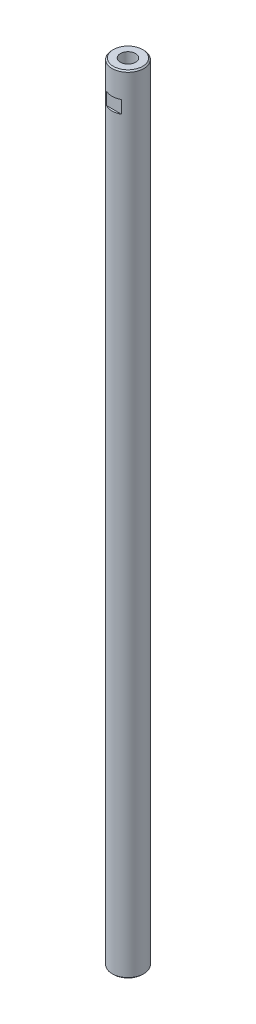
ISO-10303-21;
HEADER;
FILE_DESCRIPTION(('STEP AP214'),'2;1');
FILE_NAME('part.step','',(''),(''),'','','');
FILE_SCHEMA(('AUTOMOTIVE_DESIGN { 1 0 10303 214 1 1 1 1 }'));
ENDSEC;
DATA;
#1=APPLICATION_CONTEXT('core data for automotive mechanical design processes');
#2=APPLICATION_PROTOCOL_DEFINITION('international standard','automotive_design',2000,#1);
#3=PRODUCT_CONTEXT('',#1,'mechanical');
#4=PRODUCT('Part','Part','',(#3));
#5=PRODUCT_RELATED_PRODUCT_CATEGORY('part','',(#4));
#6=PRODUCT_DEFINITION_FORMATION('','',#4);
#7=PRODUCT_DEFINITION_CONTEXT('part definition',#1,'design');
#8=PRODUCT_DEFINITION('design','',#6,#7);
#9=PRODUCT_DEFINITION_SHAPE('','',#8);
#10=(LENGTH_UNIT() NAMED_UNIT(*) SI_UNIT(.MILLI.,.METRE.));
#11=(NAMED_UNIT(*) PLANE_ANGLE_UNIT() SI_UNIT($,.RADIAN.));
#12=(NAMED_UNIT(*) SI_UNIT($,.STERADIAN.) SOLID_ANGLE_UNIT());
#13=UNCERTAINTY_MEASURE_WITH_UNIT(LENGTH_MEASURE(1.E-05),#10,'distance_accuracy_value','');
#14=(GEOMETRIC_REPRESENTATION_CONTEXT(3) GLOBAL_UNCERTAINTY_ASSIGNED_CONTEXT((#13)) GLOBAL_UNIT_ASSIGNED_CONTEXT((#10,
#11,#12)) REPRESENTATION_CONTEXT('',''));
#15=CARTESIAN_POINT('',(0.,0.,0.));
#16=DIRECTION('',(0.,0.,1.));
#17=DIRECTION('',(1.,0.,0.));
#18=AXIS2_PLACEMENT_3D('',#15,#16,#17);
#19=CARTESIAN_POINT('',(0.,620.,0.));
#20=DIRECTION('',(0.,-1.,0.));
#21=DIRECTION('',(0.,0.,-1.));
#22=AXIS2_PLACEMENT_3D('',#19,#20,#21);
#23=CYLINDRICAL_SURFACE('',#22,12.5);
#24=CARTESIAN_POINT('',(0.,590.,0.));
#25=DIRECTION('',(0.,1.,0.));
#26=DIRECTION('',(0.,0.,1.));
#27=AXIS2_PLACEMENT_3D('',#24,#25,#26);
#28=CIRCLE('',#27,12.5);
#29=CARTESIAN_POINT('',(5.93717104351896,590.,-11.));
#30=VERTEX_POINT('',#29);
#31=CARTESIAN_POINT('',(-5.93717104351896,590.,-11.));
#32=VERTEX_POINT('',#31);
#33=EDGE_CURVE('E67',#30,#32,#28,.T.);
#34=ORIENTED_EDGE('',*,*,#33,.F.);
#35=DIRECTION('',(0.,-1.,0.));
#36=VECTOR('',#35,1.);
#37=CARTESIAN_POINT('',(5.93717104351896,620.,-11.));
#38=LINE('',#37,#36);
#39=CARTESIAN_POINT('',(5.93717104351896,600.,-11.));
#40=VERTEX_POINT('',#39);
#41=EDGE_CURVE('E82',#30,#40,#38,.F.);
#42=ORIENTED_EDGE('',*,*,#41,.T.);
#43=CARTESIAN_POINT('',(0.,600.,0.));
#44=DIRECTION('',(0.,1.,0.));
#45=DIRECTION('',(0.,0.,1.));
#46=AXIS2_PLACEMENT_3D('',#43,#44,#45);
#47=CIRCLE('',#46,12.5);
#48=CARTESIAN_POINT('',(-5.93717104351896,600.,-11.));
#49=VERTEX_POINT('',#48);
#50=EDGE_CURVE('E85',#40,#49,#47,.T.);
#51=ORIENTED_EDGE('',*,*,#50,.T.);
#52=DIRECTION('',(0.,-1.,0.));
#53=VECTOR('',#52,1.);
#54=CARTESIAN_POINT('',(-5.93717104351896,620.,-11.));
#55=LINE('',#54,#53);
#56=EDGE_CURVE('E79',#49,#32,#55,.T.);
#57=ORIENTED_EDGE('',*,*,#56,.T.);
#58=EDGE_LOOP('',(#34,#42,#51,#57));
#59=FACE_BOUND('',#58,.T.);
#60=CARTESIAN_POINT('',(0.,1.,0.));
#61=DIRECTION('',(0.,1.,0.));
#62=DIRECTION('',(0.,0.,1.));
#63=AXIS2_PLACEMENT_3D('',#60,#61,#62);
#64=CIRCLE('',#63,12.5);
#65=CARTESIAN_POINT('',(0.,1.,12.5));
#66=VERTEX_POINT('',#65);
#67=EDGE_CURVE('E94',#66,#66,#64,.T.);
#68=ORIENTED_EDGE('',*,*,#67,.T.);
#69=EDGE_LOOP('',(#68));
#70=FACE_BOUND('',#69,.T.);
#71=CARTESIAN_POINT('',(0.,619.,0.));
#72=DIRECTION('',(0.,1.,0.));
#73=DIRECTION('',(0.,0.,1.));
#74=AXIS2_PLACEMENT_3D('',#71,#72,#73);
#75=CIRCLE('',#74,12.5);
#76=CARTESIAN_POINT('',(0.,619.,12.5));
#77=VERTEX_POINT('',#76);
#78=EDGE_CURVE('E97',#77,#77,#75,.F.);
#79=ORIENTED_EDGE('',*,*,#78,.T.);
#80=EDGE_LOOP('',(#79));
#81=FACE_BOUND('',#80,.T.);
#82=CARTESIAN_POINT('',(0.,590.,0.));
#83=DIRECTION('',(0.,1.,0.));
#84=DIRECTION('',(0.,0.,1.));
#85=AXIS2_PLACEMENT_3D('',#82,#83,#84);
#86=CIRCLE('',#85,12.5);
#87=CARTESIAN_POINT('',(-5.93717104351896,590.,11.));
#88=VERTEX_POINT('',#87);
#89=CARTESIAN_POINT('',(5.93717104351896,590.,11.));
#90=VERTEX_POINT('',#89);
#91=EDGE_CURVE('E11',#88,#90,#86,.T.);
#92=ORIENTED_EDGE('',*,*,#91,.F.);
#93=DIRECTION('',(0.,-1.,0.));
#94=VECTOR('',#93,1.);
#95=CARTESIAN_POINT('',(-5.93717104351896,620.,11.));
#96=LINE('',#95,#94);
#97=CARTESIAN_POINT('',(-5.93717104351896,600.,11.));
#98=VERTEX_POINT('',#97);
#99=EDGE_CURVE('E66',#88,#98,#96,.F.);
#100=ORIENTED_EDGE('',*,*,#99,.T.);
#101=CARTESIAN_POINT('',(0.,600.,0.));
#102=DIRECTION('',(0.,1.,0.));
#103=DIRECTION('',(0.,0.,1.));
#104=AXIS2_PLACEMENT_3D('',#101,#102,#103);
#105=CIRCLE('',#104,12.5);
#106=CARTESIAN_POINT('',(5.93717104351896,600.,11.));
#107=VERTEX_POINT('',#106);
#108=EDGE_CURVE('E61',#98,#107,#105,.T.);
#109=ORIENTED_EDGE('',*,*,#108,.T.);
#110=DIRECTION('',(0.,-1.,0.));
#111=VECTOR('',#110,1.);
#112=CARTESIAN_POINT('',(5.93717104351896,620.,11.));
#113=LINE('',#112,#111);
#114=EDGE_CURVE('E25',#107,#90,#113,.T.);
#115=ORIENTED_EDGE('',*,*,#114,.T.);
#116=EDGE_LOOP('',(#92,#100,#109,#115));
#117=FACE_BOUND('',#116,.T.);
#118=ADVANCED_FACE('F17',(#59,#70,#81,#117),#23,.T.);
#119=CARTESIAN_POINT('',(0.,620.,0.));
#120=DIRECTION('',(0.,1.,0.));
#121=DIRECTION('',(0.,0.,1.));
#122=AXIS2_PLACEMENT_3D('',#119,#120,#121);
#123=PLANE('',#122);
#124=CARTESIAN_POINT('',(0.,620.,0.));
#125=DIRECTION('',(0.,1.,0.));
#126=DIRECTION('',(0.,0.,1.));
#127=AXIS2_PLACEMENT_3D('',#124,#125,#126);
#128=CIRCLE('',#127,6.);
#129=CARTESIAN_POINT('',(0.,620.,6.));
#130=VERTEX_POINT('',#129);
#131=EDGE_CURVE('E121',#130,#130,#128,.T.);
#132=ORIENTED_EDGE('',*,*,#131,.F.);
#133=EDGE_LOOP('',(#132));
#134=FACE_BOUND('',#133,.T.);
#135=CARTESIAN_POINT('',(0.,620.,0.));
#136=DIRECTION('',(0.,1.,0.));
#137=DIRECTION('',(0.,0.,1.));
#138=AXIS2_PLACEMENT_3D('',#135,#136,#137);
#139=CIRCLE('',#138,11.4999999999998);
#140=CARTESIAN_POINT('',(0.,620.,11.4999999999998));
#141=VERTEX_POINT('',#140);
#142=EDGE_CURVE('E88',#141,#141,#139,.T.);
#143=ORIENTED_EDGE('',*,*,#142,.T.);
#144=EDGE_LOOP('',(#143));
#145=FACE_BOUND('',#144,.T.);
#146=ADVANCED_FACE('F142',(#134,#145),#123,.T.);
#147=CARTESIAN_POINT('',(0.,0.,0.));
#148=DIRECTION('',(0.,1.,0.));
#149=DIRECTION('',(0.,0.,1.));
#150=AXIS2_PLACEMENT_3D('',#147,#148,#149);
#151=PLANE('',#150);
#152=CARTESIAN_POINT('',(0.,0.,0.));
#153=DIRECTION('',(0.,-1.,0.));
#154=DIRECTION('',(0.,0.,-1.));
#155=AXIS2_PLACEMENT_3D('',#152,#153,#154);
#156=CIRCLE('',#155,6.);
#157=CARTESIAN_POINT('',(0.,0.,-6.));
#158=VERTEX_POINT('',#157);
#159=EDGE_CURVE('E109',#158,#158,#156,.T.);
#160=ORIENTED_EDGE('',*,*,#159,.F.);
#161=EDGE_LOOP('',(#160));
#162=FACE_BOUND('',#161,.T.);
#163=CARTESIAN_POINT('',(0.,0.,0.));
#164=DIRECTION('',(0.,1.,0.));
#165=DIRECTION('',(0.,0.,1.));
#166=AXIS2_PLACEMENT_3D('',#163,#164,#165);
#167=CIRCLE('',#166,11.5);
#168=CARTESIAN_POINT('',(0.,0.,11.5));
#169=VERTEX_POINT('',#168);
#170=EDGE_CURVE('E91',#169,#169,#167,.F.);
#171=ORIENTED_EDGE('',*,*,#170,.T.);
#172=EDGE_LOOP('',(#171));
#173=FACE_BOUND('',#172,.T.);
#174=ADVANCED_FACE('F149',(#162,#173),#151,.F.);
#175=CARTESIAN_POINT('',(0.,1.,0.));
#176=DIRECTION('',(0.,1.,0.));
#177=DIRECTION('',(0.,0.,1.));
#178=AXIS2_PLACEMENT_3D('',#175,#176,#177);
#179=CONICAL_SURFACE('',#178,12.5,0.785398163397415);
#180=ORIENTED_EDGE('',*,*,#170,.F.);
#181=EDGE_LOOP('',(#180));
#182=FACE_BOUND('',#181,.T.);
#183=ORIENTED_EDGE('',*,*,#67,.F.);
#184=EDGE_LOOP('',(#183));
#185=FACE_BOUND('',#184,.T.);
#186=ADVANCED_FACE('F155',(#182,#185),#179,.T.);
#187=CARTESIAN_POINT('',(0.,620.,0.));
#188=DIRECTION('',(0.,-1.,0.));
#189=DIRECTION('',(0.,0.,-1.));
#190=AXIS2_PLACEMENT_3D('',#187,#188,#189);
#191=CONICAL_SURFACE('',#190,11.4999999999998,0.78539816339747);
#192=ORIENTED_EDGE('',*,*,#78,.F.);
#193=EDGE_LOOP('',(#192));
#194=FACE_BOUND('',#193,.T.);
#195=ORIENTED_EDGE('',*,*,#142,.F.);
#196=EDGE_LOOP('',(#195));
#197=FACE_BOUND('',#196,.T.);
#198=ADVANCED_FACE('F19',(#194,#197),#191,.T.);
#199=CARTESIAN_POINT('',(0.,32.75,0.));
#200=DIRECTION('',(0.,-1.,0.));
#201=DIRECTION('',(0.,0.,-1.));
#202=AXIS2_PLACEMENT_3D('',#199,#200,#201);
#203=CONICAL_SURFACE('',#202,5.1,1.02974425867665);
#204=CARTESIAN_POINT('',(0.,35.8143891570406,0.));
#205=VERTEX_POINT('',#204);
#206=VERTEX_LOOP('',#205);
#207=FACE_BOUND('',#206,.T.);
#208=CARTESIAN_POINT('',(0.,32.75,0.));
#209=DIRECTION('',(0.,-1.,0.));
#210=DIRECTION('',(0.,0.,-1.));
#211=AXIS2_PLACEMENT_3D('',#208,#209,#210);
#212=CIRCLE('',#211,5.1);
#213=CARTESIAN_POINT('',(0.,32.75,-5.1));
#214=VERTEX_POINT('',#213);
#215=EDGE_CURVE('E100',#214,#214,#212,.T.);
#216=ORIENTED_EDGE('',*,*,#215,.T.);
#217=EDGE_LOOP('',(#216));
#218=FACE_BOUND('',#217,.T.);
#219=ADVANCED_FACE('F163',(#207,#218),#203,.F.);
#220=CARTESIAN_POINT('',(0.,0.,0.));
#221=DIRECTION('',(0.,-1.,0.));
#222=DIRECTION('',(0.,0.,-1.));
#223=AXIS2_PLACEMENT_3D('',#220,#221,#222);
#224=CYLINDRICAL_SURFACE('',#223,5.1);
#225=ORIENTED_EDGE('',*,*,#215,.F.);
#226=EDGE_LOOP('',(#225));
#227=FACE_BOUND('',#226,.T.);
#228=CARTESIAN_POINT('',(0.,24.,0.));
#229=DIRECTION('',(0.,-1.,0.));
#230=DIRECTION('',(0.,0.,-1.));
#231=AXIS2_PLACEMENT_3D('',#228,#229,#230);
#232=CIRCLE('',#231,5.1);
#233=CARTESIAN_POINT('',(0.,24.,-5.1));
#234=VERTEX_POINT('',#233);
#235=EDGE_CURVE('E103',#234,#234,#232,.T.);
#236=ORIENTED_EDGE('',*,*,#235,.T.);
#237=EDGE_LOOP('',(#236));
#238=FACE_BOUND('',#237,.T.);
#239=ADVANCED_FACE('F194',(#227,#238),#224,.F.);
#240=CARTESIAN_POINT('',(5.1,24.,0.));
#241=DIRECTION('',(0.,1.,0.));
#242=DIRECTION('',(0.,0.,1.));
#243=AXIS2_PLACEMENT_3D('',#240,#241,#242);
#244=PLANE('',#243);
#245=ORIENTED_EDGE('',*,*,#235,.F.);
#246=EDGE_LOOP('',(#245));
#247=FACE_BOUND('',#246,.T.);
#248=CARTESIAN_POINT('',(0.,24.,0.));
#249=DIRECTION('',(0.,-1.,0.));
#250=DIRECTION('',(0.,0.,-1.));
#251=AXIS2_PLACEMENT_3D('',#248,#249,#250);
#252=CIRCLE('',#251,6.);
#253=CARTESIAN_POINT('',(0.,24.,-6.));
#254=VERTEX_POINT('',#253);
#255=EDGE_CURVE('E106',#254,#254,#252,.T.);
#256=ORIENTED_EDGE('',*,*,#255,.T.);
#257=EDGE_LOOP('',(#256));
#258=FACE_BOUND('',#257,.T.);
#259=ADVANCED_FACE('F183',(#247,#258),#244,.F.);
#260=CARTESIAN_POINT('',(0.,0.,0.));
#261=DIRECTION('',(0.,-1.,0.));
#262=DIRECTION('',(0.,0.,-1.));
#263=AXIS2_PLACEMENT_3D('',#260,#261,#262);
#264=CYLINDRICAL_SURFACE('',#263,6.);
#265=ORIENTED_EDGE('',*,*,#255,.F.);
#266=EDGE_LOOP('',(#265));
#267=FACE_BOUND('',#266,.T.);
#268=ORIENTED_EDGE('',*,*,#159,.T.);
#269=EDGE_LOOP('',(#268));
#270=FACE_BOUND('',#269,.T.);
#271=ADVANCED_FACE('F180',(#267,#270),#264,.F.);
#272=CARTESIAN_POINT('',(0.,587.25,0.));
#273=DIRECTION('',(0.,1.,0.));
#274=DIRECTION('',(0.,0.,1.));
#275=AXIS2_PLACEMENT_3D('',#272,#273,#274);
#276=CONICAL_SURFACE('',#275,5.1,1.02974425867664);
#277=CARTESIAN_POINT('',(0.,584.185610842959,0.));
#278=VERTEX_POINT('',#277);
#279=VERTEX_LOOP('',#278);
#280=FACE_BOUND('',#279,.T.);
#281=CARTESIAN_POINT('',(0.,587.25,0.));
#282=DIRECTION('',(0.,1.,0.));
#283=DIRECTION('',(0.,0.,1.));
#284=AXIS2_PLACEMENT_3D('',#281,#282,#283);
#285=CIRCLE('',#284,5.1);
#286=CARTESIAN_POINT('',(0.,587.25,5.1));
#287=VERTEX_POINT('',#286);
#288=EDGE_CURVE('E112',#287,#287,#285,.T.);
#289=ORIENTED_EDGE('',*,*,#288,.T.);
#290=EDGE_LOOP('',(#289));
#291=FACE_BOUND('',#290,.T.);
#292=ADVANCED_FACE('F182',(#280,#291),#276,.F.);
#293=CARTESIAN_POINT('',(0.,620.,0.));
#294=DIRECTION('',(0.,1.,0.));
#295=DIRECTION('',(0.,0.,1.));
#296=AXIS2_PLACEMENT_3D('',#293,#294,#295);
#297=CYLINDRICAL_SURFACE('',#296,5.1);
#298=ORIENTED_EDGE('',*,*,#288,.F.);
#299=EDGE_LOOP('',(#298));
#300=FACE_BOUND('',#299,.T.);
#301=CARTESIAN_POINT('',(0.,596.,0.));
#302=DIRECTION('',(0.,1.,0.));
#303=DIRECTION('',(0.,0.,1.));
#304=AXIS2_PLACEMENT_3D('',#301,#302,#303);
#305=CIRCLE('',#304,5.1);
#306=CARTESIAN_POINT('',(0.,596.,5.1));
#307=VERTEX_POINT('',#306);
#308=EDGE_CURVE('E115',#307,#307,#305,.T.);
#309=ORIENTED_EDGE('',*,*,#308,.T.);
#310=EDGE_LOOP('',(#309));
#311=FACE_BOUND('',#310,.T.);
#312=ADVANCED_FACE('F191',(#300,#311),#297,.F.);
#313=CARTESIAN_POINT('',(5.1,596.,0.));
#314=DIRECTION('',(0.,-1.,0.));
#315=DIRECTION('',(0.,0.,-1.));
#316=AXIS2_PLACEMENT_3D('',#313,#314,#315);
#317=PLANE('',#316);
#318=ORIENTED_EDGE('',*,*,#308,.F.);
#319=EDGE_LOOP('',(#318));
#320=FACE_BOUND('',#319,.T.);
#321=CARTESIAN_POINT('',(0.,596.,0.));
#322=DIRECTION('',(0.,1.,0.));
#323=DIRECTION('',(0.,0.,1.));
#324=AXIS2_PLACEMENT_3D('',#321,#322,#323);
#325=CIRCLE('',#324,6.);
#326=CARTESIAN_POINT('',(0.,596.,6.));
#327=VERTEX_POINT('',#326);
#328=EDGE_CURVE('E118',#327,#327,#325,.T.);
#329=ORIENTED_EDGE('',*,*,#328,.T.);
#330=EDGE_LOOP('',(#329));
#331=FACE_BOUND('',#330,.T.);
#332=ADVANCED_FACE('F249',(#320,#331),#317,.F.);
#333=CARTESIAN_POINT('',(0.,620.,0.));
#334=DIRECTION('',(0.,1.,0.));
#335=DIRECTION('',(0.,0.,1.));
#336=AXIS2_PLACEMENT_3D('',#333,#334,#335);
#337=CYLINDRICAL_SURFACE('',#336,6.);
#338=ORIENTED_EDGE('',*,*,#328,.F.);
#339=EDGE_LOOP('',(#338));
#340=FACE_BOUND('',#339,.T.);
#341=ORIENTED_EDGE('',*,*,#131,.T.);
#342=EDGE_LOOP('',(#341));
#343=FACE_BOUND('',#342,.T.);
#344=ADVANCED_FACE('F258',(#340,#343),#337,.F.);
#345=CARTESIAN_POINT('',(-18.1932016850018,590.,-11.));
#346=DIRECTION('',(0.,0.,1.));
#347=DIRECTION('',(1.,0.,0.));
#348=AXIS2_PLACEMENT_3D('',#345,#346,#347);
#349=PLANE('',#348);
#350=DIRECTION('',(1.,0.,0.));
#351=VECTOR('',#350,1.);
#352=CARTESIAN_POINT('',(-18.1932016850018,600.,-11.));
#353=LINE('',#352,#351);
#354=EDGE_CURVE('E38',#49,#40,#353,.T.);
#355=ORIENTED_EDGE('',*,*,#354,.T.);
#356=ORIENTED_EDGE('',*,*,#41,.F.);
#357=DIRECTION('',(1.,0.,0.));
#358=VECTOR('',#357,1.);
#359=CARTESIAN_POINT('',(-18.1932016850018,590.,-11.));
#360=LINE('',#359,#358);
#361=EDGE_CURVE('E124',#32,#30,#360,.T.);
#362=ORIENTED_EDGE('',*,*,#361,.F.);
#363=ORIENTED_EDGE('',*,*,#56,.F.);
#364=EDGE_LOOP('',(#355,#356,#362,#363));
#365=FACE_BOUND('',#364,.T.);
#366=ADVANCED_FACE('F268',(#365),#349,.F.);
#367=CARTESIAN_POINT('',(0.,590.,0.));
#368=DIRECTION('',(0.,1.,0.));
#369=DIRECTION('',(0.,0.,1.));
#370=AXIS2_PLACEMENT_3D('',#367,#368,#369);
#371=PLANE('',#370);
#372=ORIENTED_EDGE('',*,*,#33,.T.);
#373=ORIENTED_EDGE('',*,*,#361,.T.);
#374=EDGE_LOOP('',(#372,#373));
#375=FACE_BOUND('',#374,.T.);
#376=ADVANCED_FACE('F278',(#375),#371,.T.);
#377=CARTESIAN_POINT('',(0.,600.,0.));
#378=DIRECTION('',(0.,1.,0.));
#379=DIRECTION('',(0.,0.,1.));
#380=AXIS2_PLACEMENT_3D('',#377,#378,#379);
#381=PLANE('',#380);
#382=ORIENTED_EDGE('',*,*,#354,.F.);
#383=ORIENTED_EDGE('',*,*,#50,.F.);
#384=EDGE_LOOP('',(#382,#383));
#385=FACE_BOUND('',#384,.T.);
#386=ADVANCED_FACE('F139',(#385),#381,.F.);
#387=CARTESIAN_POINT('',(-18.9637372857784,590.,11.));
#388=DIRECTION('',(0.,0.,-1.));
#389=DIRECTION('',(-1.,0.,0.));
#390=AXIS2_PLACEMENT_3D('',#387,#388,#389);
#391=PLANE('',#390);
#392=DIRECTION('',(-1.,0.,0.));
#393=VECTOR('',#392,1.);
#394=CARTESIAN_POINT('',(-18.9637372857784,600.,11.));
#395=LINE('',#394,#393);
#396=EDGE_CURVE('E31',#107,#98,#395,.T.);
#397=ORIENTED_EDGE('',*,*,#396,.T.);
#398=ORIENTED_EDGE('',*,*,#99,.F.);
#399=DIRECTION('',(-1.,0.,0.));
#400=VECTOR('',#399,1.);
#401=CARTESIAN_POINT('',(-18.9637372857784,590.,11.));
#402=LINE('',#401,#400);
#403=EDGE_CURVE('E73',#90,#88,#402,.T.);
#404=ORIENTED_EDGE('',*,*,#403,.F.);
#405=ORIENTED_EDGE('',*,*,#114,.F.);
#406=EDGE_LOOP('',(#397,#398,#404,#405));
#407=FACE_BOUND('',#406,.T.);
#408=ADVANCED_FACE('F70',(#407),#391,.F.);
#409=CARTESIAN_POINT('',(0.,590.,0.));
#410=DIRECTION('',(0.,1.,0.));
#411=DIRECTION('',(0.,0.,1.));
#412=AXIS2_PLACEMENT_3D('',#409,#410,#411);
#413=PLANE('',#412);
#414=ORIENTED_EDGE('',*,*,#91,.T.);
#415=ORIENTED_EDGE('',*,*,#403,.T.);
#416=EDGE_LOOP('',(#414,#415));
#417=FACE_BOUND('',#416,.T.);
#418=ADVANCED_FACE('F129',(#417),#413,.T.);
#419=CARTESIAN_POINT('',(0.,600.,0.));
#420=DIRECTION('',(0.,1.,0.));
#421=DIRECTION('',(0.,0.,1.));
#422=AXIS2_PLACEMENT_3D('',#419,#420,#421);
#423=PLANE('',#422);
#424=ORIENTED_EDGE('',*,*,#396,.F.);
#425=ORIENTED_EDGE('',*,*,#108,.F.);
#426=EDGE_LOOP('',(#424,#425));
#427=FACE_BOUND('',#426,.T.);
#428=ADVANCED_FACE('F62',(#427),#423,.F.);
#429=CLOSED_SHELL('',(#118,#146,#174,#186,#198,#219,#239,#259,#271,#292,#312,#332,#344,#366,
#376,#386,#408,#418,#428));
#430=MANIFOLD_SOLID_BREP('B1',#429);
#431=ADVANCED_BREP_SHAPE_REPRESENTATION('',(#18,#430),#14);
#432=SHAPE_DEFINITION_REPRESENTATION(#9,#431);
ENDSEC;
END-ISO-10303-21;
